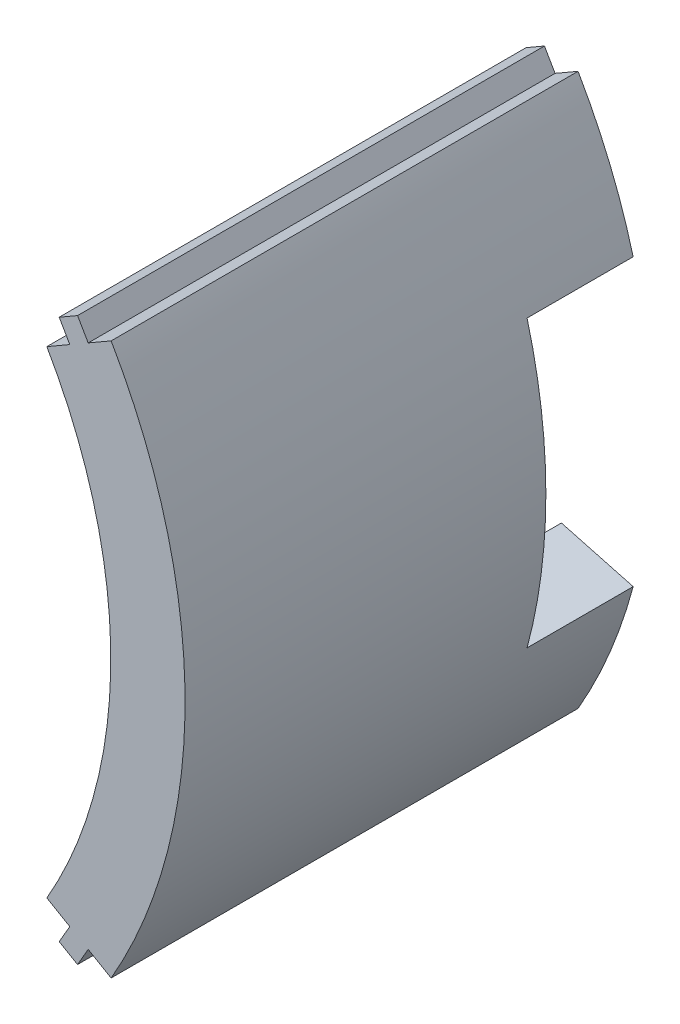
ISO-10303-21;
HEADER;
FILE_DESCRIPTION(('STEP AP214'),'2;1');
FILE_NAME('part.step','',(''),(''),'','','');
FILE_SCHEMA(('AUTOMOTIVE_DESIGN { 1 0 10303 214 1 1 1 1 }'));
ENDSEC;
DATA;
#1=APPLICATION_CONTEXT('core data for automotive mechanical design processes');
#2=APPLICATION_PROTOCOL_DEFINITION('international standard','automotive_design',2000,#1);
#3=PRODUCT_CONTEXT('',#1,'mechanical');
#4=PRODUCT('Part','Part','',(#3));
#5=PRODUCT_RELATED_PRODUCT_CATEGORY('part','',(#4));
#6=PRODUCT_DEFINITION_FORMATION('','',#4);
#7=PRODUCT_DEFINITION_CONTEXT('part definition',#1,'design');
#8=PRODUCT_DEFINITION('design','',#6,#7);
#9=PRODUCT_DEFINITION_SHAPE('','',#8);
#10=(LENGTH_UNIT() NAMED_UNIT(*) SI_UNIT(.MILLI.,.METRE.));
#11=(NAMED_UNIT(*) PLANE_ANGLE_UNIT() SI_UNIT($,.RADIAN.));
#12=(NAMED_UNIT(*) SI_UNIT($,.STERADIAN.) SOLID_ANGLE_UNIT());
#13=UNCERTAINTY_MEASURE_WITH_UNIT(LENGTH_MEASURE(1.E-05),#10,'distance_accuracy_value','');
#14=(GEOMETRIC_REPRESENTATION_CONTEXT(3) GLOBAL_UNCERTAINTY_ASSIGNED_CONTEXT((#13)) GLOBAL_UNIT_ASSIGNED_CONTEXT((#10,
#11,#12)) REPRESENTATION_CONTEXT('',''));
#15=CARTESIAN_POINT('',(0.,0.,0.));
#16=DIRECTION('',(0.,0.,1.));
#17=DIRECTION('',(1.,0.,0.));
#18=AXIS2_PLACEMENT_3D('',#15,#16,#17);
#19=CARTESIAN_POINT('',(0.,0.,0.));
#20=DIRECTION('',(0.,0.,1.));
#21=DIRECTION('',(1.,0.,0.));
#22=AXIS2_PLACEMENT_3D('',#19,#20,#21);
#23=PLANE('',#22);
#24=CARTESIAN_POINT('',(0.,0.,0.));
#25=DIRECTION('',(0.,0.,1.));
#26=DIRECTION('',(1.,0.,0.));
#27=AXIS2_PLACEMENT_3D('',#24,#25,#26);
#28=CIRCLE('',#27,26.);
#29=CARTESIAN_POINT('',(25.1140714835158,6.72929517266555,0.));
#30=VERTEX_POINT('',#29);
#31=CARTESIAN_POINT('',(22.5166604983954,13.,0.));
#32=VERTEX_POINT('',#31);
#33=EDGE_CURVE('E222',#30,#32,#28,.T.);
#34=ORIENTED_EDGE('',*,*,#33,.F.);
#35=DIRECTION('',(0.965925826289068,0.258819045102522,0.));
#36=VECTOR('',#35,1.);
#37=CARTESIAN_POINT('',(21.733331091504,5.82342851480673,0.));
#38=LINE('',#37,#36);
#39=CARTESIAN_POINT('',(21.733331091504,5.82342851480673,0.));
#40=VERTEX_POINT('',#39);
#41=EDGE_CURVE('E162',#40,#30,#38,.T.);
#42=ORIENTED_EDGE('',*,*,#41,.F.);
#43=CARTESIAN_POINT('',(0.,0.,0.));
#44=DIRECTION('',(0.,0.,-1.));
#45=DIRECTION('',(1.,0.,0.));
#46=AXIS2_PLACEMENT_3D('',#43,#44,#45);
#47=CIRCLE('',#46,22.5);
#48=CARTESIAN_POINT('',(19.4855715851499,11.25,0.));
#49=VERTEX_POINT('',#48);
#50=EDGE_CURVE('E250',#49,#40,#47,.T.);
#51=ORIENTED_EDGE('',*,*,#50,.F.);
#52=DIRECTION('',(-0.866025403784438,-0.500000000000001,0.));
#53=VECTOR('',#52,1.);
#54=CARTESIAN_POINT('',(19.4855715851499,11.25,0.));
#55=LINE('',#54,#53);
#56=CARTESIAN_POINT('',(20.5681033398804,11.875,0.));
#57=VERTEX_POINT('',#56);
#58=EDGE_CURVE('E246',#57,#49,#55,.T.);
#59=ORIENTED_EDGE('',*,*,#58,.F.);
#60=DIRECTION('',(0.500000000000001,-0.866025403784438,0.));
#61=VECTOR('',#60,1.);
#62=CARTESIAN_POINT('',(20.0681033398804,12.7410254037845,0.));
#63=LINE('',#62,#61);
#64=CARTESIAN_POINT('',(20.0681033398804,12.7410254037845,0.));
#65=VERTEX_POINT('',#64);
#66=EDGE_CURVE('E226',#65,#57,#63,.T.);
#67=ORIENTED_EDGE('',*,*,#66,.F.);
#68=DIRECTION('',(0.866025403784438,0.500000000000001,0.));
#69=VECTOR('',#68,1.);
#70=CARTESIAN_POINT('',(20.0681033398804,12.7410254037845,0.));
#71=LINE('',#70,#69);
#72=CARTESIAN_POINT('',(20.9341287436648,13.2410254037845,0.));
#73=VERTEX_POINT('',#72);
#74=EDGE_CURVE('E210',#65,#73,#71,.T.);
#75=ORIENTED_EDGE('',*,*,#74,.T.);
#76=DIRECTION('',(0.500000000000001,-0.866025403784438,0.));
#77=VECTOR('',#76,1.);
#78=CARTESIAN_POINT('',(20.9341287436648,13.2410254037845,0.));
#79=LINE('',#78,#77);
#80=CARTESIAN_POINT('',(21.4341287436648,12.375,0.));
#81=VERTEX_POINT('',#80);
#82=EDGE_CURVE('E223',#73,#81,#79,.T.);
#83=ORIENTED_EDGE('',*,*,#82,.T.);
#84=EDGE_CURVE('E247',#32,#81,#55,.T.);
#85=ORIENTED_EDGE('',*,*,#84,.F.);
#86=EDGE_LOOP('',(#34,#42,#51,#59,#67,#75,#83,#85));
#87=FACE_BOUND('',#86,.T.);
#88=ADVANCED_FACE('F34',(#87),#23,.F.);
#89=CARTESIAN_POINT('',(19.4855715851499,-11.25,22.));
#90=DIRECTION('',(0.500000000000001,0.866025403784438,0.));
#91=DIRECTION('',(-0.866025403784438,0.500000000000001,0.));
#92=AXIS2_PLACEMENT_3D('',#89,#90,#91);
#93=PLANE('',#92);
#94=DIRECTION('',(0.,0.,-1.));
#95=VECTOR('',#94,1.);
#96=CARTESIAN_POINT('',(20.5681033398804,-11.875,22.));
#97=LINE('',#96,#95);
#98=CARTESIAN_POINT('',(20.5681033398804,-11.875,22.));
#99=VERTEX_POINT('',#98);
#100=CARTESIAN_POINT('',(20.5681033398804,-11.875,0.));
#101=VERTEX_POINT('',#100);
#102=EDGE_CURVE('E178',#99,#101,#97,.T.);
#103=ORIENTED_EDGE('',*,*,#102,.F.);
#104=DIRECTION('',(0.866025403784438,-0.500000000000001,0.));
#105=VECTOR('',#104,1.);
#106=CARTESIAN_POINT('',(19.4855715851499,-11.25,22.));
#107=LINE('',#106,#105);
#108=CARTESIAN_POINT('',(19.4855715851499,-11.25,22.));
#109=VERTEX_POINT('',#108);
#110=EDGE_CURVE('E241',#109,#99,#107,.T.);
#111=ORIENTED_EDGE('',*,*,#110,.F.);
#112=DIRECTION('',(0.,0.,-1.));
#113=VECTOR('',#112,1.);
#114=CARTESIAN_POINT('',(19.4855715851499,-11.25,22.));
#115=LINE('',#114,#113);
#116=CARTESIAN_POINT('',(19.4855715851499,-11.25,0.));
#117=VERTEX_POINT('',#116);
#118=EDGE_CURVE('E256',#109,#117,#115,.T.);
#119=ORIENTED_EDGE('',*,*,#118,.T.);
#120=DIRECTION('',(0.866025403784438,-0.500000000000001,0.));
#121=VECTOR('',#120,1.);
#122=CARTESIAN_POINT('',(19.4855715851499,-11.25,0.));
#123=LINE('',#122,#121);
#124=EDGE_CURVE('E235',#117,#101,#123,.T.);
#125=ORIENTED_EDGE('',*,*,#124,.T.);
#126=EDGE_LOOP('',(#103,#111,#119,#125));
#127=FACE_BOUND('',#126,.T.);
#128=ADVANCED_FACE('F285',(#127),#93,.F.);
#129=CARTESIAN_POINT('',(19.4855715851499,11.25,22.));
#130=DIRECTION('',(0.500000000000001,-0.866025403784438,0.));
#131=DIRECTION('',(0.866025403784438,0.500000000000001,0.));
#132=AXIS2_PLACEMENT_3D('',#129,#130,#131);
#133=PLANE('',#132);
#134=DIRECTION('',(0.,0.,-1.));
#135=VECTOR('',#134,1.);
#136=CARTESIAN_POINT('',(21.4341287436648,12.375,22.));
#137=LINE('',#136,#135);
#138=CARTESIAN_POINT('',(21.4341287436648,12.375,22.));
#139=VERTEX_POINT('',#138);
#140=EDGE_CURVE('E207',#139,#81,#137,.T.);
#141=ORIENTED_EDGE('',*,*,#140,.F.);
#142=DIRECTION('',(-0.866025403784438,-0.500000000000001,0.));
#143=VECTOR('',#142,1.);
#144=CARTESIAN_POINT('',(19.4855715851499,11.25,22.));
#145=LINE('',#144,#143);
#146=CARTESIAN_POINT('',(22.5166604983954,13.,22.));
#147=VERTEX_POINT('',#146);
#148=EDGE_CURVE('E236',#147,#139,#145,.T.);
#149=ORIENTED_EDGE('',*,*,#148,.F.);
#150=DIRECTION('',(0.,0.,-1.));
#151=VECTOR('',#150,1.);
#152=CARTESIAN_POINT('',(22.5166604983954,13.,22.));
#153=LINE('',#152,#151);
#154=EDGE_CURVE('E11',#147,#32,#153,.T.);
#155=ORIENTED_EDGE('',*,*,#154,.T.);
#156=ORIENTED_EDGE('',*,*,#84,.T.);
#157=EDGE_LOOP('',(#141,#149,#155,#156));
#158=FACE_BOUND('',#157,.T.);
#159=ADVANCED_FACE('F319',(#158),#133,.F.);
#160=CARTESIAN_POINT('',(0.,0.,22.));
#161=DIRECTION('',(0.,0.,-1.));
#162=DIRECTION('',(-1.,0.,0.));
#163=AXIS2_PLACEMENT_3D('',#160,#161,#162);
#164=CYLINDRICAL_SURFACE('',#163,26.);
#165=CARTESIAN_POINT('',(0.,0.,5.));
#166=DIRECTION('',(0.,0.,-1.));
#167=DIRECTION('',(-1.,0.,0.));
#168=AXIS2_PLACEMENT_3D('',#165,#166,#167);
#169=CIRCLE('',#168,26.);
#170=CARTESIAN_POINT('',(25.1140714835158,6.72929517266555,5.));
#171=VERTEX_POINT('',#170);
#172=CARTESIAN_POINT('',(25.1140714835158,-6.72929517266556,5.));
#173=VERTEX_POINT('',#172);
#174=EDGE_CURVE('E153',#171,#173,#169,.T.);
#175=ORIENTED_EDGE('',*,*,#174,.F.);
#176=DIRECTION('',(0.,0.,-1.));
#177=VECTOR('',#176,1.);
#178=CARTESIAN_POINT('',(25.1140714835158,6.72929517266555,5.));
#179=LINE('',#178,#177);
#180=EDGE_CURVE('E189',#171,#30,#179,.T.);
#181=ORIENTED_EDGE('',*,*,#180,.T.);
#182=ORIENTED_EDGE('',*,*,#33,.T.);
#183=ORIENTED_EDGE('',*,*,#154,.F.);
#184=CARTESIAN_POINT('',(0.,0.,22.));
#185=DIRECTION('',(0.,0.,1.));
#186=DIRECTION('',(1.,0.,0.));
#187=AXIS2_PLACEMENT_3D('',#184,#185,#186);
#188=CIRCLE('',#187,26.);
#189=CARTESIAN_POINT('',(22.5166604983954,-13.,22.));
#190=VERTEX_POINT('',#189);
#191=EDGE_CURVE('E231',#190,#147,#188,.T.);
#192=ORIENTED_EDGE('',*,*,#191,.F.);
#193=DIRECTION('',(0.,0.,-1.));
#194=VECTOR('',#193,1.);
#195=CARTESIAN_POINT('',(22.5166604983954,-13.,22.));
#196=LINE('',#195,#194);
#197=CARTESIAN_POINT('',(22.5166604983954,-13.,0.));
#198=VERTEX_POINT('',#197);
#199=EDGE_CURVE('E244',#190,#198,#196,.T.);
#200=ORIENTED_EDGE('',*,*,#199,.T.);
#201=CARTESIAN_POINT('',(25.1140714835158,-6.72929517266556,0.));
#202=VERTEX_POINT('',#201);
#203=EDGE_CURVE('E167',#198,#202,#28,.T.);
#204=ORIENTED_EDGE('',*,*,#203,.T.);
#205=DIRECTION('',(0.,0.,-1.));
#206=VECTOR('',#205,1.);
#207=CARTESIAN_POINT('',(25.1140714835158,-6.72929517266556,5.));
#208=LINE('',#207,#206);
#209=EDGE_CURVE('E49',#173,#202,#208,.T.);
#210=ORIENTED_EDGE('',*,*,#209,.F.);
#211=EDGE_LOOP('',(#175,#181,#182,#183,#192,#200,#204,#210));
#212=FACE_BOUND('',#211,.T.);
#213=ADVANCED_FACE('F36',(#212),#164,.T.);
#214=CARTESIAN_POINT('',(20.5681033398804,11.875,22.));
#215=VERTEX_POINT('',#214);
#216=CARTESIAN_POINT('',(19.4855715851499,11.25,22.));
#217=VERTEX_POINT('',#216);
#218=EDGE_CURVE('E234',#215,#217,#145,.T.);
#219=ORIENTED_EDGE('',*,*,#218,.F.);
#220=DIRECTION('',(0.,0.,-1.));
#221=VECTOR('',#220,1.);
#222=CARTESIAN_POINT('',(20.5681033398804,11.875,22.));
#223=LINE('',#222,#221);
#224=EDGE_CURVE('E195',#215,#57,#223,.T.);
#225=ORIENTED_EDGE('',*,*,#224,.T.);
#226=ORIENTED_EDGE('',*,*,#58,.T.);
#227=DIRECTION('',(0.,0.,-1.));
#228=VECTOR('',#227,1.);
#229=CARTESIAN_POINT('',(19.4855715851499,11.25,22.));
#230=LINE('',#229,#228);
#231=EDGE_CURVE('E42',#217,#49,#230,.T.);
#232=ORIENTED_EDGE('',*,*,#231,.F.);
#233=EDGE_LOOP('',(#219,#225,#226,#232));
#234=FACE_BOUND('',#233,.T.);
#235=ADVANCED_FACE('F317',(#234),#133,.F.);
#236=CARTESIAN_POINT('',(0.,0.,22.));
#237=DIRECTION('',(0.,0.,-1.));
#238=DIRECTION('',(-1.,0.,0.));
#239=AXIS2_PLACEMENT_3D('',#236,#237,#238);
#240=CYLINDRICAL_SURFACE('',#239,22.5);
#241=ORIENTED_EDGE('',*,*,#50,.T.);
#242=DIRECTION('',(0.,0.,-1.));
#243=VECTOR('',#242,1.);
#244=CARTESIAN_POINT('',(21.733331091504,5.82342851480673,5.));
#245=LINE('',#244,#243);
#246=CARTESIAN_POINT('',(21.733331091504,5.82342851480673,5.));
#247=VERTEX_POINT('',#246);
#248=EDGE_CURVE('E169',#247,#40,#245,.T.);
#249=ORIENTED_EDGE('',*,*,#248,.F.);
#250=CARTESIAN_POINT('',(0.,0.,5.));
#251=DIRECTION('',(0.,0.,1.));
#252=DIRECTION('',(-1.,0.,0.));
#253=AXIS2_PLACEMENT_3D('',#250,#251,#252);
#254=CIRCLE('',#253,22.5);
#255=CARTESIAN_POINT('',(21.733331091504,-5.82342851480673,5.));
#256=VERTEX_POINT('',#255);
#257=EDGE_CURVE('E152',#256,#247,#254,.T.);
#258=ORIENTED_EDGE('',*,*,#257,.F.);
#259=DIRECTION('',(0.,0.,-1.));
#260=VECTOR('',#259,1.);
#261=CARTESIAN_POINT('',(21.733331091504,-5.82342851480673,5.));
#262=LINE('',#261,#260);
#263=CARTESIAN_POINT('',(21.733331091504,-5.82342851480673,0.));
#264=VERTEX_POINT('',#263);
#265=EDGE_CURVE('E149',#256,#264,#262,.T.);
#266=ORIENTED_EDGE('',*,*,#265,.T.);
#267=EDGE_CURVE('E249',#264,#117,#47,.T.);
#268=ORIENTED_EDGE('',*,*,#267,.T.);
#269=ORIENTED_EDGE('',*,*,#118,.F.);
#270=CARTESIAN_POINT('',(0.,0.,22.));
#271=DIRECTION('',(0.,0.,-1.));
#272=DIRECTION('',(1.,0.,0.));
#273=AXIS2_PLACEMENT_3D('',#270,#271,#272);
#274=CIRCLE('',#273,22.5);
#275=EDGE_CURVE('E239',#217,#109,#274,.T.);
#276=ORIENTED_EDGE('',*,*,#275,.F.);
#277=ORIENTED_EDGE('',*,*,#231,.T.);
#278=EDGE_LOOP('',(#241,#249,#258,#266,#268,#269,#276,#277));
#279=FACE_BOUND('',#278,.T.);
#280=ADVANCED_FACE('F263',(#279),#240,.F.);
#281=CARTESIAN_POINT('',(21.4341287436648,-12.375,22.));
#282=VERTEX_POINT('',#281);
#283=EDGE_CURVE('E57',#282,#190,#107,.T.);
#284=ORIENTED_EDGE('',*,*,#283,.F.);
#285=DIRECTION('',(0.,0.,-1.));
#286=VECTOR('',#285,1.);
#287=CARTESIAN_POINT('',(21.4341287436648,-12.375,22.));
#288=LINE('',#287,#286);
#289=CARTESIAN_POINT('',(21.4341287436648,-12.375,0.));
#290=VERTEX_POINT('',#289);
#291=EDGE_CURVE('E187',#282,#290,#288,.T.);
#292=ORIENTED_EDGE('',*,*,#291,.T.);
#293=EDGE_CURVE('E253',#290,#198,#123,.T.);
#294=ORIENTED_EDGE('',*,*,#293,.T.);
#295=ORIENTED_EDGE('',*,*,#199,.F.);
#296=EDGE_LOOP('',(#284,#292,#294,#295));
#297=FACE_BOUND('',#296,.T.);
#298=ADVANCED_FACE('F301',(#297),#93,.F.);
#299=CARTESIAN_POINT('',(0.,0.,22.));
#300=DIRECTION('',(0.,0.,1.));
#301=DIRECTION('',(1.,0.,0.));
#302=AXIS2_PLACEMENT_3D('',#299,#300,#301);
#303=PLANE('',#302);
#304=ORIENTED_EDGE('',*,*,#191,.T.);
#305=ORIENTED_EDGE('',*,*,#148,.T.);
#306=DIRECTION('',(0.500000000000001,-0.866025403784438,0.));
#307=VECTOR('',#306,1.);
#308=CARTESIAN_POINT('',(20.9341287436648,13.2410254037845,22.));
#309=LINE('',#308,#307);
#310=CARTESIAN_POINT('',(20.9341287436648,13.2410254037845,22.));
#311=VERTEX_POINT('',#310);
#312=EDGE_CURVE('E219',#311,#139,#309,.T.);
#313=ORIENTED_EDGE('',*,*,#312,.F.);
#314=DIRECTION('',(-0.866025403784437,-0.500000000000003,0.));
#315=VECTOR('',#314,1.);
#316=CARTESIAN_POINT('',(20.9341287436648,13.2410254037845,22.));
#317=LINE('',#316,#315);
#318=CARTESIAN_POINT('',(20.0681033398804,12.7410254037845,22.));
#319=VERTEX_POINT('',#318);
#320=EDGE_CURVE('E203',#311,#319,#317,.T.);
#321=ORIENTED_EDGE('',*,*,#320,.T.);
#322=DIRECTION('',(0.500000000000001,-0.866025403784438,0.));
#323=VECTOR('',#322,1.);
#324=CARTESIAN_POINT('',(20.0681033398804,12.7410254037845,22.));
#325=LINE('',#324,#323);
#326=EDGE_CURVE('E215',#319,#215,#325,.T.);
#327=ORIENTED_EDGE('',*,*,#326,.T.);
#328=ORIENTED_EDGE('',*,*,#218,.T.);
#329=ORIENTED_EDGE('',*,*,#275,.T.);
#330=ORIENTED_EDGE('',*,*,#110,.T.);
#331=DIRECTION('',(0.500000000000001,0.866025403784438,0.));
#332=VECTOR('',#331,1.);
#333=CARTESIAN_POINT('',(20.0681033398804,-12.7410254037845,22.));
#334=LINE('',#333,#332);
#335=CARTESIAN_POINT('',(20.0681033398804,-12.7410254037845,22.));
#336=VERTEX_POINT('',#335);
#337=EDGE_CURVE('E192',#336,#99,#334,.T.);
#338=ORIENTED_EDGE('',*,*,#337,.F.);
#339=DIRECTION('',(0.866025403784437,-0.500000000000003,0.));
#340=VECTOR('',#339,1.);
#341=CARTESIAN_POINT('',(20.0681033398804,-12.7410254037845,22.));
#342=LINE('',#341,#340);
#343=CARTESIAN_POINT('',(20.9341287436648,-13.2410254037845,22.));
#344=VERTEX_POINT('',#343);
#345=EDGE_CURVE('E174',#336,#344,#342,.T.);
#346=ORIENTED_EDGE('',*,*,#345,.T.);
#347=DIRECTION('',(0.500000000000001,0.866025403784438,0.));
#348=VECTOR('',#347,1.);
#349=CARTESIAN_POINT('',(20.9341287436648,-13.2410254037845,22.));
#350=LINE('',#349,#348);
#351=EDGE_CURVE('E186',#344,#282,#350,.T.);
#352=ORIENTED_EDGE('',*,*,#351,.T.);
#353=ORIENTED_EDGE('',*,*,#283,.T.);
#354=EDGE_LOOP('',(#304,#305,#313,#321,#327,#328,#329,#330,#338,#346,#352,#353));
#355=FACE_BOUND('',#354,.T.);
#356=ADVANCED_FACE('F288',(#355),#303,.T.);
#357=ORIENTED_EDGE('',*,*,#267,.F.);
#358=DIRECTION('',(-0.965925826289068,0.258819045102522,0.));
#359=VECTOR('',#358,1.);
#360=CARTESIAN_POINT('',(21.733331091504,-5.82342851480673,0.));
#361=LINE('',#360,#359);
#362=EDGE_CURVE('E273',#202,#264,#361,.T.);
#363=ORIENTED_EDGE('',*,*,#362,.F.);
#364=ORIENTED_EDGE('',*,*,#203,.F.);
#365=ORIENTED_EDGE('',*,*,#293,.F.);
#366=DIRECTION('',(0.500000000000001,0.866025403784438,0.));
#367=VECTOR('',#366,1.);
#368=CARTESIAN_POINT('',(20.9341287436648,-13.2410254037845,0.));
#369=LINE('',#368,#367);
#370=CARTESIAN_POINT('',(20.9341287436648,-13.2410254037845,0.));
#371=VERTEX_POINT('',#370);
#372=EDGE_CURVE('E199',#371,#290,#369,.T.);
#373=ORIENTED_EDGE('',*,*,#372,.F.);
#374=DIRECTION('',(-0.866025403784438,0.500000000000001,0.));
#375=VECTOR('',#374,1.);
#376=CARTESIAN_POINT('',(20.9341287436648,-13.2410254037845,0.));
#377=LINE('',#376,#375);
#378=CARTESIAN_POINT('',(20.0681033398804,-12.7410254037845,0.));
#379=VERTEX_POINT('',#378);
#380=EDGE_CURVE('E181',#371,#379,#377,.T.);
#381=ORIENTED_EDGE('',*,*,#380,.T.);
#382=DIRECTION('',(0.500000000000001,0.866025403784438,0.));
#383=VECTOR('',#382,1.);
#384=CARTESIAN_POINT('',(20.0681033398804,-12.7410254037845,0.));
#385=LINE('',#384,#383);
#386=EDGE_CURVE('E196',#379,#101,#385,.T.);
#387=ORIENTED_EDGE('',*,*,#386,.T.);
#388=ORIENTED_EDGE('',*,*,#124,.F.);
#389=EDGE_LOOP('',(#357,#363,#364,#365,#373,#381,#387,#388));
#390=FACE_BOUND('',#389,.T.);
#391=ADVANCED_FACE('F282',(#390),#23,.F.);
#392=CARTESIAN_POINT('',(20.9341287436648,13.2410254037845,22.));
#393=DIRECTION('',(-0.866025403784438,-0.500000000000001,0.));
#394=DIRECTION('',(0.500000000000001,-0.866025403784438,0.));
#395=AXIS2_PLACEMENT_3D('',#392,#393,#394);
#396=PLANE('',#395);
#397=ORIENTED_EDGE('',*,*,#140,.T.);
#398=ORIENTED_EDGE('',*,*,#82,.F.);
#399=DIRECTION('',(0.,0.,-1.));
#400=VECTOR('',#399,1.);
#401=CARTESIAN_POINT('',(20.9341287436648,13.2410254037845,22.));
#402=LINE('',#401,#400);
#403=EDGE_CURVE('E213',#311,#73,#402,.T.);
#404=ORIENTED_EDGE('',*,*,#403,.F.);
#405=ORIENTED_EDGE('',*,*,#312,.T.);
#406=EDGE_LOOP('',(#397,#398,#404,#405));
#407=FACE_BOUND('',#406,.T.);
#408=ADVANCED_FACE('F307',(#407),#396,.F.);
#409=CARTESIAN_POINT('',(20.0681033398804,12.7410254037845,22.));
#410=DIRECTION('',(-0.866025403784438,-0.500000000000001,0.));
#411=DIRECTION('',(0.500000000000001,-0.866025403784438,0.));
#412=AXIS2_PLACEMENT_3D('',#409,#410,#411);
#413=PLANE('',#412);
#414=ORIENTED_EDGE('',*,*,#224,.F.);
#415=ORIENTED_EDGE('',*,*,#326,.F.);
#416=DIRECTION('',(0.,0.,-1.));
#417=VECTOR('',#416,1.);
#418=CARTESIAN_POINT('',(20.0681033398804,12.7410254037845,22.));
#419=LINE('',#418,#417);
#420=EDGE_CURVE('E206',#319,#65,#419,.T.);
#421=ORIENTED_EDGE('',*,*,#420,.T.);
#422=ORIENTED_EDGE('',*,*,#66,.T.);
#423=EDGE_LOOP('',(#414,#415,#421,#422));
#424=FACE_BOUND('',#423,.T.);
#425=ADVANCED_FACE('F316',(#424),#413,.T.);
#426=CARTESIAN_POINT('',(-0.499999999999978,0.866025403784398,0.));
#427=DIRECTION('',(0.500000000000003,-0.866025403784437,0.));
#428=DIRECTION('',(0.866025403784437,0.500000000000003,0.));
#429=AXIS2_PLACEMENT_3D('',#426,#427,#428);
#430=PLANE('',#429);
#431=ORIENTED_EDGE('',*,*,#320,.F.);
#432=ORIENTED_EDGE('',*,*,#403,.T.);
#433=ORIENTED_EDGE('',*,*,#74,.F.);
#434=ORIENTED_EDGE('',*,*,#420,.F.);
#435=EDGE_LOOP('',(#431,#432,#433,#434));
#436=FACE_BOUND('',#435,.T.);
#437=ADVANCED_FACE('F313',(#436),#430,.F.);
#438=CARTESIAN_POINT('',(20.0681033398804,-12.7410254037845,22.));
#439=DIRECTION('',(0.866025403784438,-0.500000000000001,0.));
#440=DIRECTION('',(0.500000000000001,0.866025403784438,0.));
#441=AXIS2_PLACEMENT_3D('',#438,#439,#440);
#442=PLANE('',#441);
#443=ORIENTED_EDGE('',*,*,#102,.T.);
#444=ORIENTED_EDGE('',*,*,#386,.F.);
#445=DIRECTION('',(0.,0.,-1.));
#446=VECTOR('',#445,1.);
#447=CARTESIAN_POINT('',(20.0681033398804,-12.7410254037845,22.));
#448=LINE('',#447,#446);
#449=EDGE_CURVE('E184',#336,#379,#448,.T.);
#450=ORIENTED_EDGE('',*,*,#449,.F.);
#451=ORIENTED_EDGE('',*,*,#337,.T.);
#452=EDGE_LOOP('',(#443,#444,#450,#451));
#453=FACE_BOUND('',#452,.T.);
#454=ADVANCED_FACE('F291',(#453),#442,.F.);
#455=CARTESIAN_POINT('',(20.9341287436648,-13.2410254037845,22.));
#456=DIRECTION('',(0.866025403784438,-0.500000000000001,0.));
#457=DIRECTION('',(0.500000000000001,0.866025403784438,0.));
#458=AXIS2_PLACEMENT_3D('',#455,#456,#457);
#459=PLANE('',#458);
#460=ORIENTED_EDGE('',*,*,#291,.F.);
#461=ORIENTED_EDGE('',*,*,#351,.F.);
#462=DIRECTION('',(0.,0.,-1.));
#463=VECTOR('',#462,1.);
#464=CARTESIAN_POINT('',(20.9341287436648,-13.2410254037845,22.));
#465=LINE('',#464,#463);
#466=EDGE_CURVE('E177',#344,#371,#465,.T.);
#467=ORIENTED_EDGE('',*,*,#466,.T.);
#468=ORIENTED_EDGE('',*,*,#372,.T.);
#469=EDGE_LOOP('',(#460,#461,#467,#468));
#470=FACE_BOUND('',#469,.T.);
#471=ADVANCED_FACE('F299',(#470),#459,.T.);
#472=CARTESIAN_POINT('',(-0.499999999999978,-0.866025403784397,0.));
#473=DIRECTION('',(0.500000000000003,0.866025403784437,0.));
#474=DIRECTION('',(-0.866025403784437,0.500000000000003,0.));
#475=AXIS2_PLACEMENT_3D('',#472,#473,#474);
#476=PLANE('',#475);
#477=ORIENTED_EDGE('',*,*,#345,.F.);
#478=ORIENTED_EDGE('',*,*,#449,.T.);
#479=ORIENTED_EDGE('',*,*,#380,.F.);
#480=ORIENTED_EDGE('',*,*,#466,.F.);
#481=EDGE_LOOP('',(#477,#478,#479,#480));
#482=FACE_BOUND('',#481,.T.);
#483=ADVANCED_FACE('F296',(#482),#476,.F.);
#484=CARTESIAN_POINT('',(21.733331091504,5.82342851480673,5.));
#485=DIRECTION('',(-0.258819045102522,0.965925826289068,0.));
#486=DIRECTION('',(-0.965925826289068,-0.258819045102522,0.));
#487=AXIS2_PLACEMENT_3D('',#484,#485,#486);
#488=PLANE('',#487);
#489=ORIENTED_EDGE('',*,*,#41,.T.);
#490=ORIENTED_EDGE('',*,*,#180,.F.);
#491=DIRECTION('',(0.965925826289068,0.258819045102522,0.));
#492=VECTOR('',#491,1.);
#493=CARTESIAN_POINT('',(21.733331091504,5.82342851480673,5.));
#494=LINE('',#493,#492);
#495=EDGE_CURVE('E159',#247,#171,#494,.T.);
#496=ORIENTED_EDGE('',*,*,#495,.F.);
#497=ORIENTED_EDGE('',*,*,#248,.T.);
#498=EDGE_LOOP('',(#489,#490,#496,#497));
#499=FACE_BOUND('',#498,.T.);
#500=ADVANCED_FACE('F277',(#499),#488,.F.);
#501=CARTESIAN_POINT('',(21.733331091504,-5.82342851480673,5.));
#502=DIRECTION('',(-0.258819045102522,-0.965925826289068,0.));
#503=DIRECTION('',(0.965925826289068,-0.258819045102522,0.));
#504=AXIS2_PLACEMENT_3D('',#501,#502,#503);
#505=PLANE('',#504);
#506=ORIENTED_EDGE('',*,*,#362,.T.);
#507=ORIENTED_EDGE('',*,*,#265,.F.);
#508=DIRECTION('',(-0.965925826289068,0.258819045102522,0.));
#509=VECTOR('',#508,1.);
#510=CARTESIAN_POINT('',(21.733331091504,-5.82342851480673,5.));
#511=LINE('',#510,#509);
#512=EDGE_CURVE('E145',#173,#256,#511,.T.);
#513=ORIENTED_EDGE('',*,*,#512,.F.);
#514=ORIENTED_EDGE('',*,*,#209,.T.);
#515=EDGE_LOOP('',(#506,#507,#513,#514));
#516=FACE_BOUND('',#515,.T.);
#517=ADVANCED_FACE('F147',(#516),#505,.F.);
#518=CARTESIAN_POINT('',(0.,0.,5.));
#519=DIRECTION('',(0.,0.,-1.));
#520=DIRECTION('',(-1.,0.,0.));
#521=AXIS2_PLACEMENT_3D('',#518,#519,#520);
#522=PLANE('',#521);
#523=ORIENTED_EDGE('',*,*,#174,.T.);
#524=ORIENTED_EDGE('',*,*,#512,.T.);
#525=ORIENTED_EDGE('',*,*,#257,.T.);
#526=ORIENTED_EDGE('',*,*,#495,.T.);
#527=EDGE_LOOP('',(#523,#524,#525,#526));
#528=FACE_BOUND('',#527,.T.);
#529=ADVANCED_FACE('F157',(#528),#522,.T.);
#530=CLOSED_SHELL('',(#88,#128,#159,#213,#235,#280,#298,#356,#391,#408,#425,#437,#454,#471,#483,
#500,#517,#529));
#531=MANIFOLD_SOLID_BREP('B2',#530);
#532=ADVANCED_BREP_SHAPE_REPRESENTATION('',(#18,#531),#14);
#533=SHAPE_DEFINITION_REPRESENTATION(#9,#532);
ENDSEC;
END-ISO-10303-21;
